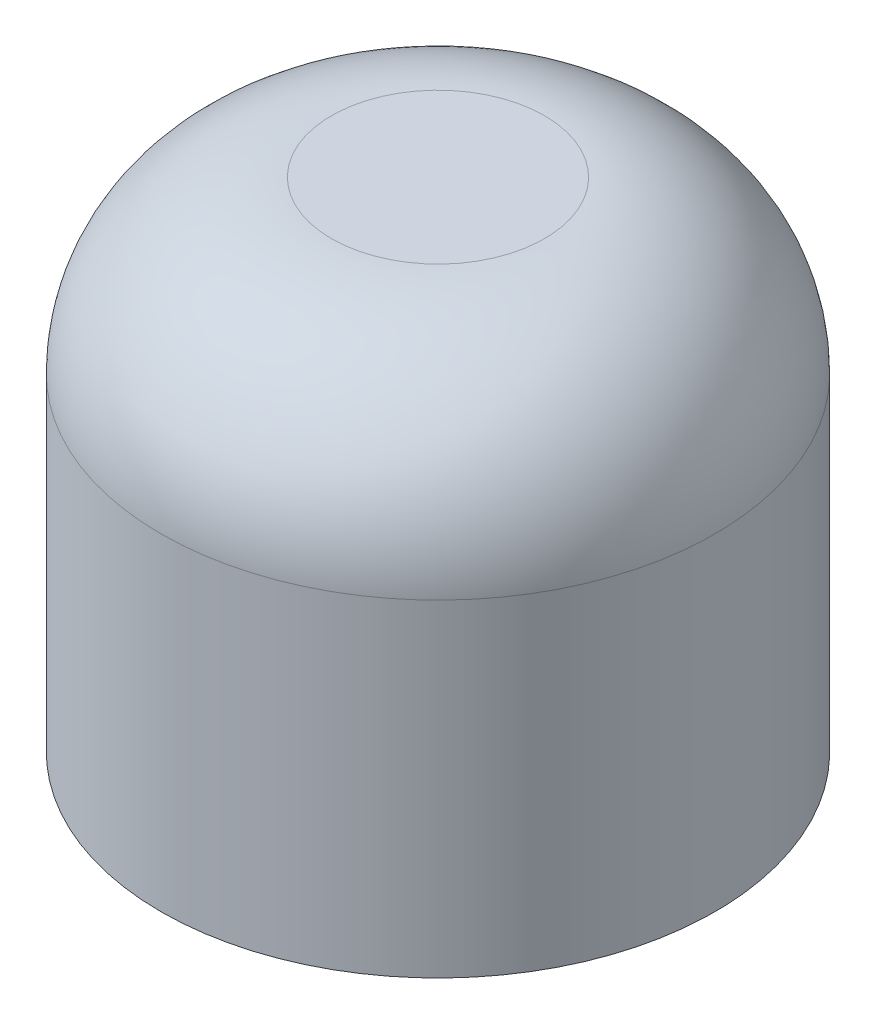
ISO-10303-21;
HEADER;
FILE_DESCRIPTION(('STEP AP214'),'2;1');
FILE_NAME('part.step','',(''),(''),'','','');
FILE_SCHEMA(('AUTOMOTIVE_DESIGN { 1 0 10303 214 1 1 1 1 }'));
ENDSEC;
DATA;
#1=APPLICATION_CONTEXT('core data for automotive mechanical design processes');
#2=APPLICATION_PROTOCOL_DEFINITION('international standard','automotive_design',2000,#1);
#3=PRODUCT_CONTEXT('',#1,'mechanical');
#4=PRODUCT('Part','Part','',(#3));
#5=PRODUCT_RELATED_PRODUCT_CATEGORY('part','',(#4));
#6=PRODUCT_DEFINITION_FORMATION('','',#4);
#7=PRODUCT_DEFINITION_CONTEXT('part definition',#1,'design');
#8=PRODUCT_DEFINITION('design','',#6,#7);
#9=PRODUCT_DEFINITION_SHAPE('','',#8);
#10=(LENGTH_UNIT() NAMED_UNIT(*) SI_UNIT(.MILLI.,.METRE.));
#11=(NAMED_UNIT(*) PLANE_ANGLE_UNIT() SI_UNIT($,.RADIAN.));
#12=(NAMED_UNIT(*) SI_UNIT($,.STERADIAN.) SOLID_ANGLE_UNIT());
#13=UNCERTAINTY_MEASURE_WITH_UNIT(LENGTH_MEASURE(1.E-05),#10,'distance_accuracy_value','');
#14=(GEOMETRIC_REPRESENTATION_CONTEXT(3) GLOBAL_UNCERTAINTY_ASSIGNED_CONTEXT((#13)) GLOBAL_UNIT_ASSIGNED_CONTEXT((#10,
#11,#12)) REPRESENTATION_CONTEXT('',''));
#15=CARTESIAN_POINT('',(0.,0.,0.));
#16=DIRECTION('',(0.,0.,1.));
#17=DIRECTION('',(1.,0.,0.));
#18=AXIS2_PLACEMENT_3D('',#15,#16,#17);
#19=CARTESIAN_POINT('',(0.,0.,0.));
#20=DIRECTION('',(0.,1.,0.));
#21=DIRECTION('',(0.,0.,1.));
#22=AXIS2_PLACEMENT_3D('',#19,#20,#21);
#23=PLANE('',#22);
#24=CARTESIAN_POINT('',(0.,0.,0.));
#25=DIRECTION('',(0.,1.,0.));
#26=DIRECTION('',(0.,0.,1.));
#27=AXIS2_PLACEMENT_3D('',#24,#25,#26);
#28=CIRCLE('',#27,14.65);
#29=CARTESIAN_POINT('',(0.,0.,14.65));
#30=VERTEX_POINT('',#29);
#31=EDGE_CURVE('E52',#30,#30,#28,.T.);
#32=ORIENTED_EDGE('',*,*,#31,.T.);
#33=EDGE_LOOP('',(#32));
#34=FACE_BOUND('',#33,.T.);
#35=CARTESIAN_POINT('',(0.,0.,0.));
#36=DIRECTION('',(0.,1.,0.));
#37=DIRECTION('',(0.,0.,1.));
#38=AXIS2_PLACEMENT_3D('',#35,#36,#37);
#39=CIRCLE('',#38,16.25);
#40=CARTESIAN_POINT('',(0.,0.,16.25));
#41=VERTEX_POINT('',#40);
#42=EDGE_CURVE('E57',#41,#41,#39,.T.);
#43=ORIENTED_EDGE('',*,*,#42,.F.);
#44=EDGE_LOOP('',(#43));
#45=FACE_BOUND('',#44,.T.);
#46=ADVANCED_FACE('F37',(#34,#45),#23,.F.);
#47=CARTESIAN_POINT('',(0.,24.,0.));
#48=DIRECTION('',(0.,-1.,0.));
#49=DIRECTION('',(0.,0.,-1.));
#50=AXIS2_PLACEMENT_3D('',#47,#48,#49);
#51=CYLINDRICAL_SURFACE('',#50,16.25);
#52=CARTESIAN_POINT('',(0.,19.2,0.));
#53=DIRECTION('',(0.,1.,0.));
#54=DIRECTION('',(0.,0.,1.));
#55=AXIS2_PLACEMENT_3D('',#52,#53,#54);
#56=CIRCLE('',#55,16.25);
#57=CARTESIAN_POINT('',(0.,19.2,16.25));
#58=VERTEX_POINT('',#57);
#59=EDGE_CURVE('E10',#58,#58,#56,.F.);
#60=ORIENTED_EDGE('',*,*,#59,.T.);
#61=EDGE_LOOP('',(#60));
#62=FACE_BOUND('',#61,.T.);
#63=ORIENTED_EDGE('',*,*,#42,.T.);
#64=EDGE_LOOP('',(#63));
#65=FACE_BOUND('',#64,.T.);
#66=ADVANCED_FACE('F79',(#62,#65),#51,.T.);
#67=CARTESIAN_POINT('',(0.,24.,0.));
#68=DIRECTION('',(0.,-1.,0.));
#69=DIRECTION('',(0.,0.,-1.));
#70=AXIS2_PLACEMENT_3D('',#67,#68,#69);
#71=CYLINDRICAL_SURFACE('',#70,13.65);
#72=CARTESIAN_POINT('',(0.,1.,0.));
#73=DIRECTION('',(0.,1.,0.));
#74=DIRECTION('',(0.,0.,1.));
#75=AXIS2_PLACEMENT_3D('',#72,#73,#74);
#76=CIRCLE('',#75,13.65);
#77=CARTESIAN_POINT('',(0.,1.,13.65));
#78=VERTEX_POINT('',#77);
#79=EDGE_CURVE('E48',#78,#78,#76,.F.);
#80=ORIENTED_EDGE('',*,*,#79,.T.);
#81=EDGE_LOOP('',(#80));
#82=FACE_BOUND('',#81,.T.);
#83=CARTESIAN_POINT('',(0.,24.,0.));
#84=DIRECTION('',(0.,1.,0.));
#85=DIRECTION('',(0.,0.,1.));
#86=AXIS2_PLACEMENT_3D('',#83,#84,#85);
#87=CIRCLE('',#86,13.65);
#88=CARTESIAN_POINT('',(0.,24.,13.65));
#89=VERTEX_POINT('',#88);
#90=EDGE_CURVE('E60',#89,#89,#87,.T.);
#91=ORIENTED_EDGE('',*,*,#90,.T.);
#92=EDGE_LOOP('',(#91));
#93=FACE_BOUND('',#92,.T.);
#94=ADVANCED_FACE('F64',(#82,#93),#71,.F.);
#95=CARTESIAN_POINT('',(0.,0.,0.));
#96=DIRECTION('',(0.,-1.,0.));
#97=DIRECTION('',(0.,0.,-1.));
#98=AXIS2_PLACEMENT_3D('',#95,#96,#97);
#99=CONICAL_SURFACE('',#98,14.65,0.785398163397447);
#100=ORIENTED_EDGE('',*,*,#79,.F.);
#101=EDGE_LOOP('',(#100));
#102=FACE_BOUND('',#101,.T.);
#103=ORIENTED_EDGE('',*,*,#31,.F.);
#104=EDGE_LOOP('',(#103));
#105=FACE_BOUND('',#104,.T.);
#106=ADVANCED_FACE('F69',(#102,#105),#99,.F.);
#107=CARTESIAN_POINT('',(0.,24.,0.));
#108=DIRECTION('',(0.,1.,0.));
#109=DIRECTION('',(0.,0.,1.));
#110=AXIS2_PLACEMENT_3D('',#107,#108,#109);
#111=PLANE('',#110);
#112=ORIENTED_EDGE('',*,*,#90,.F.);
#113=EDGE_LOOP('',(#112));
#114=FACE_BOUND('',#113,.T.);
#115=ADVANCED_FACE('F66',(#114),#111,.F.);
#116=CARTESIAN_POINT('',(0.,29.2,0.));
#117=DIRECTION('',(0.,1.,0.));
#118=DIRECTION('',(0.,0.,1.));
#119=AXIS2_PLACEMENT_3D('',#116,#117,#118);
#120=PLANE('',#119);
#121=CARTESIAN_POINT('',(0.,29.2,0.));
#122=DIRECTION('',(0.,1.,0.));
#123=DIRECTION('',(0.,0.,1.));
#124=AXIS2_PLACEMENT_3D('',#121,#122,#123);
#125=CIRCLE('',#124,6.25);
#126=CARTESIAN_POINT('',(0.,29.2,6.25));
#127=VERTEX_POINT('',#126);
#128=EDGE_CURVE('E44',#127,#127,#125,.T.);
#129=ORIENTED_EDGE('',*,*,#128,.T.);
#130=EDGE_LOOP('',(#129));
#131=FACE_BOUND('',#130,.T.);
#132=ADVANCED_FACE('F68',(#131),#120,.T.);
#133=CARTESIAN_POINT('',(0.,19.2,0.));
#134=DIRECTION('',(0.,1.,0.));
#135=DIRECTION('',(0.,0.,1.));
#136=AXIS2_PLACEMENT_3D('',#133,#134,#135);
#137=DEGENERATE_TOROIDAL_SURFACE('',#136,6.25,10.,.T.);
#138=ORIENTED_EDGE('',*,*,#59,.F.);
#139=EDGE_LOOP('',(#138));
#140=FACE_BOUND('',#139,.T.);
#141=ORIENTED_EDGE('',*,*,#128,.F.);
#142=EDGE_LOOP('',(#141));
#143=FACE_BOUND('',#142,.T.);
#144=ADVANCED_FACE('F39',(#140,#143),#137,.T.);
#145=CLOSED_SHELL('',(#46,#66,#94,#106,#115,#132,#144));
#146=MANIFOLD_SOLID_BREP('B2',#145);
#147=ADVANCED_BREP_SHAPE_REPRESENTATION('',(#18,#146),#14);
#148=SHAPE_DEFINITION_REPRESENTATION(#9,#147);
ENDSEC;
END-ISO-10303-21;
